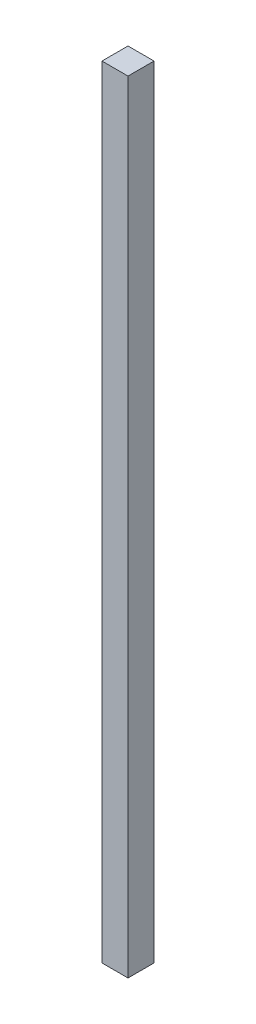
ISO-10303-21;
HEADER;
FILE_DESCRIPTION(('STEP AP214'),'2;1');
FILE_NAME('part.step','',(''),(''),'','','');
FILE_SCHEMA(('AUTOMOTIVE_DESIGN { 1 0 10303 214 1 1 1 1 }'));
ENDSEC;
DATA;
#1=APPLICATION_CONTEXT('core data for automotive mechanical design processes');
#2=APPLICATION_PROTOCOL_DEFINITION('international standard','automotive_design',2000,#1);
#3=PRODUCT_CONTEXT('',#1,'mechanical');
#4=PRODUCT('Part','Part','',(#3));
#5=PRODUCT_RELATED_PRODUCT_CATEGORY('part','',(#4));
#6=PRODUCT_DEFINITION_FORMATION('','',#4);
#7=PRODUCT_DEFINITION_CONTEXT('part definition',#1,'design');
#8=PRODUCT_DEFINITION('design','',#6,#7);
#9=PRODUCT_DEFINITION_SHAPE('','',#8);
#10=(LENGTH_UNIT() NAMED_UNIT(*) SI_UNIT(.MILLI.,.METRE.));
#11=(NAMED_UNIT(*) PLANE_ANGLE_UNIT() SI_UNIT($,.RADIAN.));
#12=(NAMED_UNIT(*) SI_UNIT($,.STERADIAN.) SOLID_ANGLE_UNIT());
#13=UNCERTAINTY_MEASURE_WITH_UNIT(LENGTH_MEASURE(1.E-05),#10,'distance_accuracy_value','');
#14=(GEOMETRIC_REPRESENTATION_CONTEXT(3) GLOBAL_UNCERTAINTY_ASSIGNED_CONTEXT((#13)) GLOBAL_UNIT_ASSIGNED_CONTEXT((#10,
#11,#12)) REPRESENTATION_CONTEXT('',''));
#15=CARTESIAN_POINT('',(0.,0.,0.));
#16=DIRECTION('',(0.,0.,1.));
#17=DIRECTION('',(1.,0.,0.));
#18=AXIS2_PLACEMENT_3D('',#15,#16,#17);
#19=CARTESIAN_POINT('',(10.,600.,-10.));
#20=DIRECTION('',(-1.,0.,0.));
#21=DIRECTION('',(0.,0.,1.));
#22=AXIS2_PLACEMENT_3D('',#19,#20,#21);
#23=PLANE('',#22);
#24=DIRECTION('',(0.,0.,-1.));
#25=VECTOR('',#24,1.);
#26=CARTESIAN_POINT('',(10.,0.,-10.));
#27=LINE('',#26,#25);
#28=CARTESIAN_POINT('',(10.,0.,9.99999999999999));
#29=VERTEX_POINT('',#28);
#30=CARTESIAN_POINT('',(10.,0.,-10.));
#31=VERTEX_POINT('',#30);
#32=EDGE_CURVE('E96',#29,#31,#27,.T.);
#33=ORIENTED_EDGE('',*,*,#32,.T.);
#34=DIRECTION('',(0.,-1.,0.));
#35=VECTOR('',#34,1.);
#36=CARTESIAN_POINT('',(10.,600.,-10.));
#37=LINE('',#36,#35);
#38=CARTESIAN_POINT('',(10.,600.,-10.));
#39=VERTEX_POINT('',#38);
#40=EDGE_CURVE('E11',#39,#31,#37,.T.);
#41=ORIENTED_EDGE('',*,*,#40,.F.);
#42=DIRECTION('',(0.,0.,-1.));
#43=VECTOR('',#42,1.);
#44=CARTESIAN_POINT('',(10.,600.,-10.));
#45=LINE('',#44,#43);
#46=CARTESIAN_POINT('',(10.,600.,9.99999999999999));
#47=VERTEX_POINT('',#46);
#48=EDGE_CURVE('E84',#47,#39,#45,.T.);
#49=ORIENTED_EDGE('',*,*,#48,.F.);
#50=DIRECTION('',(0.,-1.,0.));
#51=VECTOR('',#50,1.);
#52=CARTESIAN_POINT('',(10.,600.,9.99999999999999));
#53=LINE('',#52,#51);
#54=EDGE_CURVE('E92',#47,#29,#53,.T.);
#55=ORIENTED_EDGE('',*,*,#54,.T.);
#56=EDGE_LOOP('',(#33,#41,#49,#55));
#57=FACE_BOUND('',#56,.T.);
#58=ADVANCED_FACE('F33',(#57),#23,.F.);
#59=CARTESIAN_POINT('',(-10.,600.,-10.));
#60=DIRECTION('',(0.,0.,1.));
#61=DIRECTION('',(1.,0.,0.));
#62=AXIS2_PLACEMENT_3D('',#59,#60,#61);
#63=PLANE('',#62);
#64=DIRECTION('',(-1.,0.,0.));
#65=VECTOR('',#64,1.);
#66=CARTESIAN_POINT('',(-10.,0.,-10.));
#67=LINE('',#66,#65);
#68=CARTESIAN_POINT('',(-10.,0.,-10.));
#69=VERTEX_POINT('',#68);
#70=EDGE_CURVE('E88',#31,#69,#67,.T.);
#71=ORIENTED_EDGE('',*,*,#70,.T.);
#72=DIRECTION('',(0.,-1.,0.));
#73=VECTOR('',#72,1.);
#74=CARTESIAN_POINT('',(-10.,600.,-10.));
#75=LINE('',#74,#73);
#76=CARTESIAN_POINT('',(-10.,600.,-10.));
#77=VERTEX_POINT('',#76);
#78=EDGE_CURVE('E41',#77,#69,#75,.T.);
#79=ORIENTED_EDGE('',*,*,#78,.F.);
#80=DIRECTION('',(-1.,0.,0.));
#81=VECTOR('',#80,1.);
#82=CARTESIAN_POINT('',(-10.,600.,-10.));
#83=LINE('',#82,#81);
#84=EDGE_CURVE('E79',#39,#77,#83,.T.);
#85=ORIENTED_EDGE('',*,*,#84,.F.);
#86=ORIENTED_EDGE('',*,*,#40,.T.);
#87=EDGE_LOOP('',(#71,#79,#85,#86));
#88=FACE_BOUND('',#87,.T.);
#89=ADVANCED_FACE('F87',(#88),#63,.F.);
#90=CARTESIAN_POINT('',(-10.,600.,-10.));
#91=DIRECTION('',(1.,0.,0.));
#92=DIRECTION('',(0.,0.,-1.));
#93=AXIS2_PLACEMENT_3D('',#90,#91,#92);
#94=PLANE('',#93);
#95=DIRECTION('',(0.,0.,1.));
#96=VECTOR('',#95,1.);
#97=CARTESIAN_POINT('',(-10.,0.,-10.));
#98=LINE('',#97,#96);
#99=CARTESIAN_POINT('',(-10.,0.,9.99999999999999));
#100=VERTEX_POINT('',#99);
#101=EDGE_CURVE('E66',#69,#100,#98,.T.);
#102=ORIENTED_EDGE('',*,*,#101,.T.);
#103=DIRECTION('',(0.,-1.,0.));
#104=VECTOR('',#103,1.);
#105=CARTESIAN_POINT('',(-10.,600.,9.99999999999999));
#106=LINE('',#105,#104);
#107=CARTESIAN_POINT('',(-10.,600.,9.99999999999999));
#108=VERTEX_POINT('',#107);
#109=EDGE_CURVE('E89',#108,#100,#106,.T.);
#110=ORIENTED_EDGE('',*,*,#109,.F.);
#111=DIRECTION('',(0.,0.,1.));
#112=VECTOR('',#111,1.);
#113=CARTESIAN_POINT('',(-10.,600.,-10.));
#114=LINE('',#113,#112);
#115=EDGE_CURVE('E82',#77,#108,#114,.T.);
#116=ORIENTED_EDGE('',*,*,#115,.F.);
#117=ORIENTED_EDGE('',*,*,#78,.T.);
#118=EDGE_LOOP('',(#102,#110,#116,#117));
#119=FACE_BOUND('',#118,.T.);
#120=ADVANCED_FACE('F90',(#119),#94,.F.);
#121=CARTESIAN_POINT('',(-10.,600.,9.99999999999999));
#122=DIRECTION('',(0.,0.,-1.));
#123=DIRECTION('',(-1.,0.,0.));
#124=AXIS2_PLACEMENT_3D('',#121,#122,#123);
#125=PLANE('',#124);
#126=DIRECTION('',(1.,0.,0.));
#127=VECTOR('',#126,1.);
#128=CARTESIAN_POINT('',(-10.,0.,9.99999999999999));
#129=LINE('',#128,#127);
#130=EDGE_CURVE('E72',#100,#29,#129,.T.);
#131=ORIENTED_EDGE('',*,*,#130,.T.);
#132=ORIENTED_EDGE('',*,*,#54,.F.);
#133=DIRECTION('',(1.,0.,0.));
#134=VECTOR('',#133,1.);
#135=CARTESIAN_POINT('',(-10.,600.,9.99999999999999));
#136=LINE('',#135,#134);
#137=EDGE_CURVE('E49',#108,#47,#136,.T.);
#138=ORIENTED_EDGE('',*,*,#137,.F.);
#139=ORIENTED_EDGE('',*,*,#109,.T.);
#140=EDGE_LOOP('',(#131,#132,#138,#139));
#141=FACE_BOUND('',#140,.T.);
#142=ADVANCED_FACE('F103',(#141),#125,.F.);
#143=CARTESIAN_POINT('',(0.,600.,0.));
#144=DIRECTION('',(0.,1.,0.));
#145=DIRECTION('',(0.,0.,1.));
#146=AXIS2_PLACEMENT_3D('',#143,#144,#145);
#147=PLANE('',#146);
#148=ORIENTED_EDGE('',*,*,#48,.T.);
#149=ORIENTED_EDGE('',*,*,#84,.T.);
#150=ORIENTED_EDGE('',*,*,#115,.T.);
#151=ORIENTED_EDGE('',*,*,#137,.T.);
#152=EDGE_LOOP('',(#148,#149,#150,#151));
#153=FACE_BOUND('',#152,.T.);
#154=ADVANCED_FACE('F80',(#153),#147,.T.);
#155=CARTESIAN_POINT('',(0.,0.,0.));
#156=DIRECTION('',(0.,1.,0.));
#157=DIRECTION('',(0.,0.,1.));
#158=AXIS2_PLACEMENT_3D('',#155,#156,#157);
#159=PLANE('',#158);
#160=ORIENTED_EDGE('',*,*,#32,.F.);
#161=ORIENTED_EDGE('',*,*,#130,.F.);
#162=ORIENTED_EDGE('',*,*,#101,.F.);
#163=ORIENTED_EDGE('',*,*,#70,.F.);
#164=EDGE_LOOP('',(#160,#161,#162,#163));
#165=FACE_BOUND('',#164,.T.);
#166=ADVANCED_FACE('F106',(#165),#159,.F.);
#167=CLOSED_SHELL('',(#58,#89,#120,#142,#154,#166));
#168=MANIFOLD_SOLID_BREP('B2',#167);
#169=ADVANCED_BREP_SHAPE_REPRESENTATION('',(#18,#168),#14);
#170=SHAPE_DEFINITION_REPRESENTATION(#9,#169);
ENDSEC;
END-ISO-10303-21;
